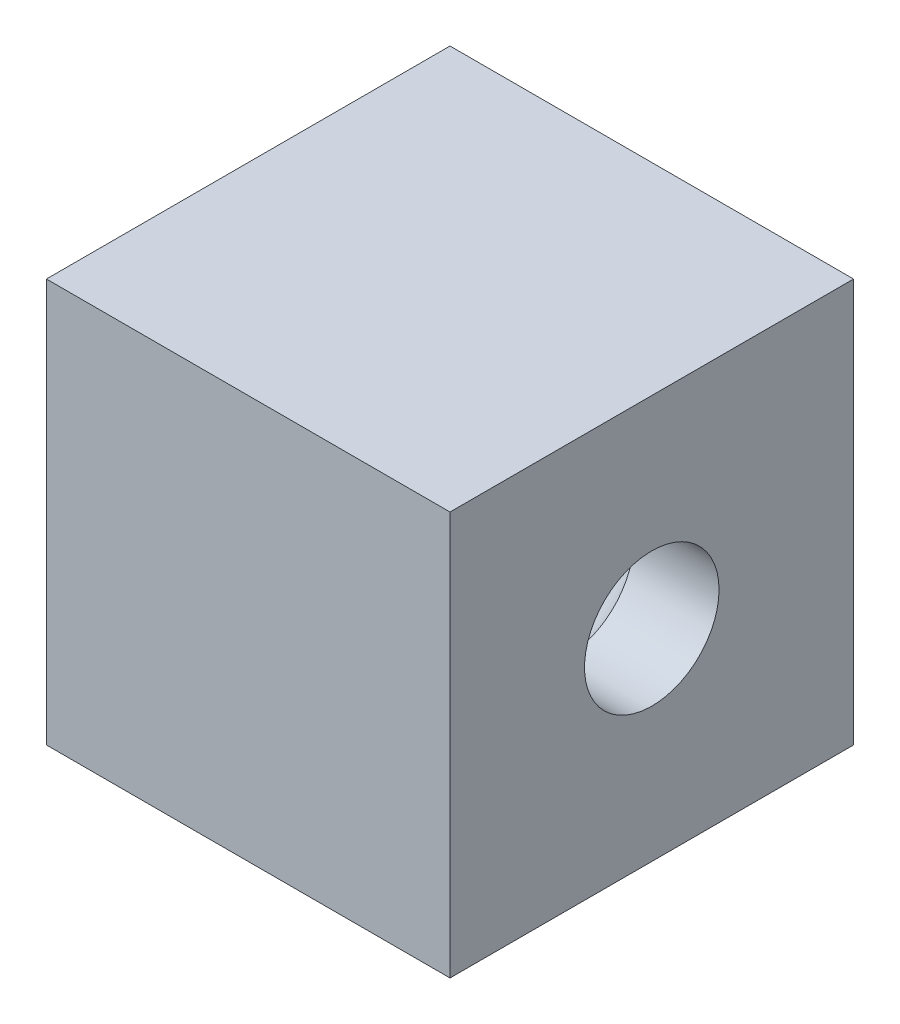
ISO-10303-21;
HEADER;
FILE_DESCRIPTION(('STEP AP214'),'2;1');
FILE_NAME('part.step','',(''),(''),'','','');
FILE_SCHEMA(('AUTOMOTIVE_DESIGN { 1 0 10303 214 1 1 1 1 }'));
ENDSEC;
DATA;
#1=APPLICATION_CONTEXT('core data for automotive mechanical design processes');
#2=APPLICATION_PROTOCOL_DEFINITION('international standard','automotive_design',2000,#1);
#3=PRODUCT_CONTEXT('',#1,'mechanical');
#4=PRODUCT('Part','Part','',(#3));
#5=PRODUCT_RELATED_PRODUCT_CATEGORY('part','',(#4));
#6=PRODUCT_DEFINITION_FORMATION('','',#4);
#7=PRODUCT_DEFINITION_CONTEXT('part definition',#1,'design');
#8=PRODUCT_DEFINITION('design','',#6,#7);
#9=PRODUCT_DEFINITION_SHAPE('','',#8);
#10=(LENGTH_UNIT() NAMED_UNIT(*) SI_UNIT(.MILLI.,.METRE.));
#11=(NAMED_UNIT(*) PLANE_ANGLE_UNIT() SI_UNIT($,.RADIAN.));
#12=(NAMED_UNIT(*) SI_UNIT($,.STERADIAN.) SOLID_ANGLE_UNIT());
#13=UNCERTAINTY_MEASURE_WITH_UNIT(LENGTH_MEASURE(1.E-05),#10,'distance_accuracy_value','');
#14=(GEOMETRIC_REPRESENTATION_CONTEXT(3) GLOBAL_UNCERTAINTY_ASSIGNED_CONTEXT((#13)) GLOBAL_UNIT_ASSIGNED_CONTEXT((#10,
#11,#12)) REPRESENTATION_CONTEXT('',''));
#15=CARTESIAN_POINT('',(0.,0.,0.));
#16=DIRECTION('',(0.,0.,1.));
#17=DIRECTION('',(1.,0.,0.));
#18=AXIS2_PLACEMENT_3D('',#15,#16,#17);
#19=CARTESIAN_POINT('',(15.,15.,-15.));
#20=DIRECTION('',(1.,0.,0.));
#21=DIRECTION('',(0.,0.,-1.));
#22=AXIS2_PLACEMENT_3D('',#19,#20,#21);
#23=CYLINDRICAL_SURFACE('',#22,5.);
#24=CARTESIAN_POINT('',(30.,15.,-15.));
#25=DIRECTION('',(1.,0.,0.));
#26=DIRECTION('',(0.,0.,-1.));
#27=AXIS2_PLACEMENT_3D('',#24,#25,#26);
#28=CIRCLE('',#27,5.);
#29=CARTESIAN_POINT('',(30.,15.,-20.));
#30=VERTEX_POINT('',#29);
#31=EDGE_CURVE('E105',#30,#30,#28,.T.);
#32=ORIENTED_EDGE('',*,*,#31,.T.);
#33=EDGE_LOOP('',(#32));
#34=FACE_BOUND('',#33,.T.);
#35=CARTESIAN_POINT('',(23.6602540378444,15.,-15.));
#36=DIRECTION('',(-1.,0.,0.));
#37=DIRECTION('',(0.,0.,1.));
#38=AXIS2_PLACEMENT_3D('',#35,#36,#37);
#39=CIRCLE('',#38,5.);
#40=CARTESIAN_POINT('',(23.6602540378444,15.,-10.));
#41=VERTEX_POINT('',#40);
#42=EDGE_CURVE('E37',#41,#41,#39,.F.);
#43=ORIENTED_EDGE('',*,*,#42,.F.);
#44=EDGE_LOOP('',(#43));
#45=FACE_BOUND('',#44,.T.);
#46=ADVANCED_FACE('F33',(#34,#45),#23,.F.);
#47=CARTESIAN_POINT('',(0.,30.,-30.));
#48=DIRECTION('',(0.,0.,-1.));
#49=DIRECTION('',(-1.,0.,0.));
#50=AXIS2_PLACEMENT_3D('',#47,#48,#49);
#51=PLANE('',#50);
#52=DIRECTION('',(1.,0.,0.));
#53=VECTOR('',#52,1.);
#54=CARTESIAN_POINT('',(0.,0.,-30.));
#55=LINE('',#54,#53);
#56=CARTESIAN_POINT('',(0.,0.,-30.));
#57=VERTEX_POINT('',#56);
#58=CARTESIAN_POINT('',(30.,0.,-30.));
#59=VERTEX_POINT('',#58);
#60=EDGE_CURVE('E101',#57,#59,#55,.T.);
#61=ORIENTED_EDGE('',*,*,#60,.F.);
#62=DIRECTION('',(0.,-1.,0.));
#63=VECTOR('',#62,1.);
#64=CARTESIAN_POINT('',(0.,30.,-30.));
#65=LINE('',#64,#63);
#66=CARTESIAN_POINT('',(0.,30.,-30.));
#67=VERTEX_POINT('',#66);
#68=EDGE_CURVE('E11',#67,#57,#65,.T.);
#69=ORIENTED_EDGE('',*,*,#68,.F.);
#70=DIRECTION('',(1.,0.,0.));
#71=VECTOR('',#70,1.);
#72=CARTESIAN_POINT('',(0.,30.,-30.));
#73=LINE('',#72,#71);
#74=CARTESIAN_POINT('',(30.,30.,-30.));
#75=VERTEX_POINT('',#74);
#76=EDGE_CURVE('E94',#67,#75,#73,.T.);
#77=ORIENTED_EDGE('',*,*,#76,.T.);
#78=DIRECTION('',(0.,-1.,0.));
#79=VECTOR('',#78,1.);
#80=CARTESIAN_POINT('',(30.,30.,-30.));
#81=LINE('',#80,#79);
#82=EDGE_CURVE('E91',#75,#59,#81,.T.);
#83=ORIENTED_EDGE('',*,*,#82,.T.);
#84=EDGE_LOOP('',(#61,#69,#77,#83));
#85=FACE_BOUND('',#84,.T.);
#86=ADVANCED_FACE('F35',(#85),#51,.T.);
#87=CARTESIAN_POINT('',(0.,30.,0.));
#88=DIRECTION('',(-1.,0.,0.));
#89=DIRECTION('',(0.,0.,1.));
#90=AXIS2_PLACEMENT_3D('',#87,#88,#89);
#91=PLANE('',#90);
#92=DIRECTION('',(0.,0.,-1.));
#93=VECTOR('',#92,1.);
#94=CARTESIAN_POINT('',(0.,0.,0.));
#95=LINE('',#94,#93);
#96=CARTESIAN_POINT('',(0.,0.,0.));
#97=VERTEX_POINT('',#96);
#98=EDGE_CURVE('E96',#97,#57,#95,.T.);
#99=ORIENTED_EDGE('',*,*,#98,.F.);
#100=DIRECTION('',(0.,-1.,0.));
#101=VECTOR('',#100,1.);
#102=CARTESIAN_POINT('',(0.,30.,0.));
#103=LINE('',#102,#101);
#104=CARTESIAN_POINT('',(0.,30.,0.));
#105=VERTEX_POINT('',#104);
#106=EDGE_CURVE('E43',#105,#97,#103,.T.);
#107=ORIENTED_EDGE('',*,*,#106,.F.);
#108=DIRECTION('',(0.,0.,-1.));
#109=VECTOR('',#108,1.);
#110=CARTESIAN_POINT('',(0.,30.,0.));
#111=LINE('',#110,#109);
#112=EDGE_CURVE('E82',#105,#67,#111,.T.);
#113=ORIENTED_EDGE('',*,*,#112,.T.);
#114=ORIENTED_EDGE('',*,*,#68,.T.);
#115=EDGE_LOOP('',(#99,#107,#113,#114));
#116=FACE_BOUND('',#115,.T.);
#117=ADVANCED_FACE('F112',(#116),#91,.T.);
#118=CARTESIAN_POINT('',(0.,30.,0.));
#119=DIRECTION('',(0.,0.,-1.));
#120=DIRECTION('',(-1.,0.,0.));
#121=AXIS2_PLACEMENT_3D('',#118,#119,#120);
#122=PLANE('',#121);
#123=DIRECTION('',(1.,0.,0.));
#124=VECTOR('',#123,1.);
#125=CARTESIAN_POINT('',(0.,0.,0.));
#126=LINE('',#125,#124);
#127=CARTESIAN_POINT('',(30.,0.,0.));
#128=VERTEX_POINT('',#127);
#129=EDGE_CURVE('E87',#97,#128,#126,.T.);
#130=ORIENTED_EDGE('',*,*,#129,.T.);
#131=DIRECTION('',(0.,-1.,0.));
#132=VECTOR('',#131,1.);
#133=CARTESIAN_POINT('',(30.,30.,0.));
#134=LINE('',#133,#132);
#135=CARTESIAN_POINT('',(30.,30.,0.));
#136=VERTEX_POINT('',#135);
#137=EDGE_CURVE('E85',#136,#128,#134,.T.);
#138=ORIENTED_EDGE('',*,*,#137,.F.);
#139=DIRECTION('',(1.,0.,0.));
#140=VECTOR('',#139,1.);
#141=CARTESIAN_POINT('',(0.,30.,0.));
#142=LINE('',#141,#140);
#143=EDGE_CURVE('E79',#105,#136,#142,.T.);
#144=ORIENTED_EDGE('',*,*,#143,.F.);
#145=ORIENTED_EDGE('',*,*,#106,.T.);
#146=EDGE_LOOP('',(#130,#138,#144,#145));
#147=FACE_BOUND('',#146,.T.);
#148=ADVANCED_FACE('F86',(#147),#122,.F.);
#149=CARTESIAN_POINT('',(30.,30.,0.));
#150=DIRECTION('',(-1.,0.,0.));
#151=DIRECTION('',(0.,0.,1.));
#152=AXIS2_PLACEMENT_3D('',#149,#150,#151);
#153=PLANE('',#152);
#154=ORIENTED_EDGE('',*,*,#31,.F.);
#155=EDGE_LOOP('',(#154));
#156=FACE_BOUND('',#155,.T.);
#157=DIRECTION('',(0.,0.,-1.));
#158=VECTOR('',#157,1.);
#159=CARTESIAN_POINT('',(30.,0.,0.));
#160=LINE('',#159,#158);
#161=EDGE_CURVE('E104',#128,#59,#160,.T.);
#162=ORIENTED_EDGE('',*,*,#161,.T.);
#163=ORIENTED_EDGE('',*,*,#82,.F.);
#164=DIRECTION('',(0.,0.,-1.));
#165=VECTOR('',#164,1.);
#166=CARTESIAN_POINT('',(30.,30.,0.));
#167=LINE('',#166,#165);
#168=EDGE_CURVE('E76',#136,#75,#167,.T.);
#169=ORIENTED_EDGE('',*,*,#168,.F.);
#170=ORIENTED_EDGE('',*,*,#137,.T.);
#171=EDGE_LOOP('',(#162,#163,#169,#170));
#172=FACE_BOUND('',#171,.T.);
#173=ADVANCED_FACE('F93',(#156,#172),#153,.F.);
#174=CARTESIAN_POINT('',(0.,30.,0.));
#175=DIRECTION('',(0.,1.,0.));
#176=DIRECTION('',(0.,0.,1.));
#177=AXIS2_PLACEMENT_3D('',#174,#175,#176);
#178=PLANE('',#177);
#179=ORIENTED_EDGE('',*,*,#76,.F.);
#180=ORIENTED_EDGE('',*,*,#112,.F.);
#181=ORIENTED_EDGE('',*,*,#143,.T.);
#182=ORIENTED_EDGE('',*,*,#168,.T.);
#183=EDGE_LOOP('',(#179,#180,#181,#182));
#184=FACE_BOUND('',#183,.T.);
#185=ADVANCED_FACE('F81',(#184),#178,.T.);
#186=CARTESIAN_POINT('',(0.,0.,0.));
#187=DIRECTION('',(0.,1.,0.));
#188=DIRECTION('',(0.,0.,1.));
#189=AXIS2_PLACEMENT_3D('',#186,#187,#188);
#190=PLANE('',#189);
#191=ORIENTED_EDGE('',*,*,#60,.T.);
#192=ORIENTED_EDGE('',*,*,#161,.F.);
#193=ORIENTED_EDGE('',*,*,#129,.F.);
#194=ORIENTED_EDGE('',*,*,#98,.T.);
#195=EDGE_LOOP('',(#191,#192,#193,#194));
#196=FACE_BOUND('',#195,.T.);
#197=ADVANCED_FACE('F111',(#196),#190,.F.);
#198=CARTESIAN_POINT('',(15.,15.,-15.));
#199=DIRECTION('',(0.,0.,-1.));
#200=DIRECTION('',(0.,1.,0.));
#201=AXIS2_PLACEMENT_3D('',#198,#199,#200);
#202=SPHERICAL_SURFACE('',#201,10.);
#203=CARTESIAN_POINT('',(15.,15.,-15.));
#204=DIRECTION('',(-1.,0.,0.));
#205=DIRECTION('',(0.,0.,1.));
#206=AXIS2_PLACEMENT_3D('',#203,#204,#205);
#207=SPHERICAL_SURFACE('',#206,10.);
#208=ORIENTED_EDGE('',*,*,#42,.T.);
#209=EDGE_LOOP('',(#208));
#210=FACE_BOUND('',#209,.T.);
#211=ADVANCED_FACE('F130',(#210),#207,.F.);
#212=CLOSED_SHELL('',(#46,#86,#117,#148,#173,#185,#197,#211));
#213=MANIFOLD_SOLID_BREP('B2',#212);
#214=ADVANCED_BREP_SHAPE_REPRESENTATION('',(#18,#213),#14);
#215=SHAPE_DEFINITION_REPRESENTATION(#9,#214);
ENDSEC;
END-ISO-10303-21;
